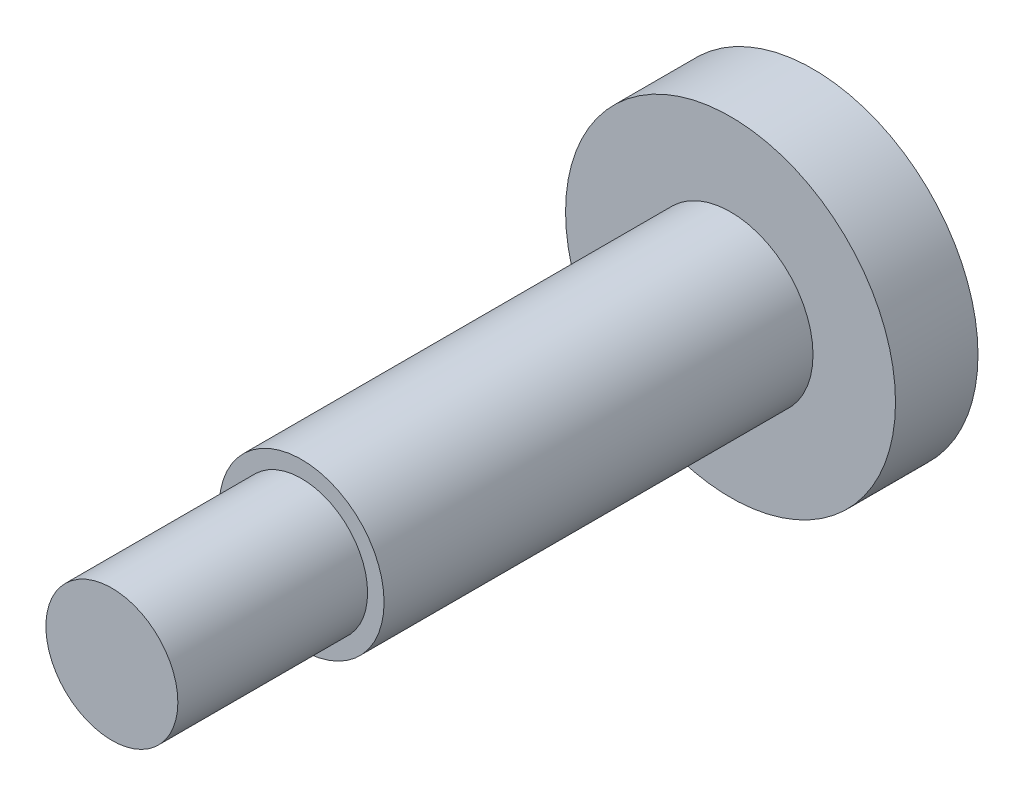
ISO-10303-21;
HEADER;
FILE_DESCRIPTION(('STEP AP214'),'2;1');
FILE_NAME('part.step','',(''),(''),'','','');
FILE_SCHEMA(('AUTOMOTIVE_DESIGN { 1 0 10303 214 1 1 1 1 }'));
ENDSEC;
DATA;
#1=APPLICATION_CONTEXT('core data for automotive mechanical design processes');
#2=APPLICATION_PROTOCOL_DEFINITION('international standard','automotive_design',2000,#1);
#3=PRODUCT_CONTEXT('',#1,'mechanical');
#4=PRODUCT('Part','Part','',(#3));
#5=PRODUCT_RELATED_PRODUCT_CATEGORY('part','',(#4));
#6=PRODUCT_DEFINITION_FORMATION('','',#4);
#7=PRODUCT_DEFINITION_CONTEXT('part definition',#1,'design');
#8=PRODUCT_DEFINITION('design','',#6,#7);
#9=PRODUCT_DEFINITION_SHAPE('','',#8);
#10=(LENGTH_UNIT() NAMED_UNIT(*) SI_UNIT(.MILLI.,.METRE.));
#11=(NAMED_UNIT(*) PLANE_ANGLE_UNIT() SI_UNIT($,.RADIAN.));
#12=(NAMED_UNIT(*) SI_UNIT($,.STERADIAN.) SOLID_ANGLE_UNIT());
#13=UNCERTAINTY_MEASURE_WITH_UNIT(LENGTH_MEASURE(1.E-05),#10,'distance_accuracy_value','');
#14=(GEOMETRIC_REPRESENTATION_CONTEXT(3) GLOBAL_UNCERTAINTY_ASSIGNED_CONTEXT((#13)) GLOBAL_UNIT_ASSIGNED_CONTEXT((#10,
#11,#12)) REPRESENTATION_CONTEXT('',''));
#15=CARTESIAN_POINT('',(0.,0.,0.));
#16=DIRECTION('',(0.,0.,1.));
#17=DIRECTION('',(1.,0.,0.));
#18=AXIS2_PLACEMENT_3D('',#15,#16,#17);
#19=CARTESIAN_POINT('',(0.,0.,7.5));
#20=DIRECTION('',(0.,0.,-1.));
#21=DIRECTION('',(-1.,0.,0.));
#22=AXIS2_PLACEMENT_3D('',#19,#20,#21);
#23=CYLINDRICAL_SURFACE('',#22,1.);
#24=CARTESIAN_POINT('',(0.,0.,0.));
#25=DIRECTION('',(0.,0.,1.));
#26=DIRECTION('',(1.,0.,0.));
#27=AXIS2_PLACEMENT_3D('',#24,#25,#26);
#28=CIRCLE('',#27,1.);
#29=CARTESIAN_POINT('',(1.,0.,0.));
#30=VERTEX_POINT('',#29);
#31=EDGE_CURVE('E10',#30,#30,#28,.T.);
#32=ORIENTED_EDGE('',*,*,#31,.T.);
#33=EDGE_LOOP('',(#32));
#34=FACE_BOUND('',#33,.T.);
#35=CARTESIAN_POINT('',(0.,0.,5.2));
#36=DIRECTION('',(0.,0.,1.));
#37=DIRECTION('',(1.,0.,0.));
#38=AXIS2_PLACEMENT_3D('',#35,#36,#37);
#39=CIRCLE('',#38,1.);
#40=CARTESIAN_POINT('',(1.,0.,5.2));
#41=VERTEX_POINT('',#40);
#42=EDGE_CURVE('E43',#41,#41,#39,.T.);
#43=ORIENTED_EDGE('',*,*,#42,.F.);
#44=EDGE_LOOP('',(#43));
#45=FACE_BOUND('',#44,.T.);
#46=ADVANCED_FACE('F39',(#34,#45),#23,.T.);
#47=CARTESIAN_POINT('',(0.,0.,0.));
#48=DIRECTION('',(0.,0.,-1.));
#49=DIRECTION('',(-1.,0.,0.));
#50=AXIS2_PLACEMENT_3D('',#47,#48,#49);
#51=CYLINDRICAL_SURFACE('',#50,2.);
#52=CARTESIAN_POINT('',(0.,0.,0.));
#53=DIRECTION('',(0.,0.,1.));
#54=DIRECTION('',(1.,0.,0.));
#55=AXIS2_PLACEMENT_3D('',#52,#53,#54);
#56=CIRCLE('',#55,2.);
#57=CARTESIAN_POINT('',(2.,0.,0.));
#58=VERTEX_POINT('',#57);
#59=EDGE_CURVE('E50',#58,#58,#56,.T.);
#60=ORIENTED_EDGE('',*,*,#59,.F.);
#61=EDGE_LOOP('',(#60));
#62=FACE_BOUND('',#61,.T.);
#63=CARTESIAN_POINT('',(0.,0.,-1.));
#64=DIRECTION('',(0.,0.,1.));
#65=DIRECTION('',(1.,0.,0.));
#66=AXIS2_PLACEMENT_3D('',#63,#64,#65);
#67=CIRCLE('',#66,2.);
#68=CARTESIAN_POINT('',(2.,0.,-1.));
#69=VERTEX_POINT('',#68);
#70=EDGE_CURVE('E55',#69,#69,#67,.T.);
#71=ORIENTED_EDGE('',*,*,#70,.T.);
#72=EDGE_LOOP('',(#71));
#73=FACE_BOUND('',#72,.T.);
#74=ADVANCED_FACE('F41',(#62,#73),#51,.T.);
#75=CARTESIAN_POINT('',(0.,0.,0.));
#76=DIRECTION('',(0.,0.,1.));
#77=DIRECTION('',(1.,0.,0.));
#78=AXIS2_PLACEMENT_3D('',#75,#76,#77);
#79=PLANE('',#78);
#80=ORIENTED_EDGE('',*,*,#31,.F.);
#81=EDGE_LOOP('',(#80));
#82=FACE_BOUND('',#81,.T.);
#83=ORIENTED_EDGE('',*,*,#59,.T.);
#84=EDGE_LOOP('',(#83));
#85=FACE_BOUND('',#84,.T.);
#86=ADVANCED_FACE('F88',(#82,#85),#79,.T.);
#87=CARTESIAN_POINT('',(0.,0.,-1.));
#88=DIRECTION('',(0.,0.,1.));
#89=DIRECTION('',(1.,0.,0.));
#90=AXIS2_PLACEMENT_3D('',#87,#88,#89);
#91=PLANE('',#90);
#92=ORIENTED_EDGE('',*,*,#70,.F.);
#93=EDGE_LOOP('',(#92));
#94=FACE_BOUND('',#93,.T.);
#95=ADVANCED_FACE('F82',(#94),#91,.F.);
#96=CARTESIAN_POINT('',(0.,0.,5.2));
#97=DIRECTION('',(0.,0.,1.));
#98=DIRECTION('',(1.,0.,0.));
#99=AXIS2_PLACEMENT_3D('',#96,#97,#98);
#100=PLANE('',#99);
#101=CARTESIAN_POINT('',(0.,0.,5.2));
#102=DIRECTION('',(0.,0.,1.));
#103=DIRECTION('',(1.,0.,0.));
#104=AXIS2_PLACEMENT_3D('',#101,#102,#103);
#105=CIRCLE('',#104,0.8);
#106=CARTESIAN_POINT('',(0.8,0.,5.2));
#107=VERTEX_POINT('',#106);
#108=EDGE_CURVE('E62',#107,#107,#105,.T.);
#109=ORIENTED_EDGE('',*,*,#108,.F.);
#110=EDGE_LOOP('',(#109));
#111=FACE_BOUND('',#110,.T.);
#112=ORIENTED_EDGE('',*,*,#42,.T.);
#113=EDGE_LOOP('',(#112));
#114=FACE_BOUND('',#113,.T.);
#115=ADVANCED_FACE('F71',(#111,#114),#100,.T.);
#116=CARTESIAN_POINT('',(0.,0.,5.2));
#117=DIRECTION('',(0.,0.,1.));
#118=DIRECTION('',(1.,0.,0.));
#119=AXIS2_PLACEMENT_3D('',#116,#117,#118);
#120=CYLINDRICAL_SURFACE('',#119,0.8);
#121=ORIENTED_EDGE('',*,*,#108,.T.);
#122=EDGE_LOOP('',(#121));
#123=FACE_BOUND('',#122,.T.);
#124=CARTESIAN_POINT('',(0.,0.,7.5));
#125=DIRECTION('',(0.,0.,1.));
#126=DIRECTION('',(1.,0.,0.));
#127=AXIS2_PLACEMENT_3D('',#124,#125,#126);
#128=CIRCLE('',#127,0.8);
#129=CARTESIAN_POINT('',(0.8,0.,7.5));
#130=VERTEX_POINT('',#129);
#131=EDGE_CURVE('E54',#130,#130,#128,.T.);
#132=ORIENTED_EDGE('',*,*,#131,.F.);
#133=EDGE_LOOP('',(#132));
#134=FACE_BOUND('',#133,.T.);
#135=ADVANCED_FACE('F74',(#123,#134),#120,.T.);
#136=CARTESIAN_POINT('',(0.,0.,7.5));
#137=DIRECTION('',(0.,0.,1.));
#138=DIRECTION('',(1.,0.,0.));
#139=AXIS2_PLACEMENT_3D('',#136,#137,#138);
#140=PLANE('',#139);
#141=ORIENTED_EDGE('',*,*,#131,.T.);
#142=EDGE_LOOP('',(#141));
#143=FACE_BOUND('',#142,.T.);
#144=ADVANCED_FACE('F69',(#143),#140,.T.);
#145=CLOSED_SHELL('',(#46,#74,#86,#95,#115,#135,#144));
#146=MANIFOLD_SOLID_BREP('B2',#145);
#147=ADVANCED_BREP_SHAPE_REPRESENTATION('',(#18,#146),#14);
#148=SHAPE_DEFINITION_REPRESENTATION(#9,#147);
ENDSEC;
END-ISO-10303-21;
